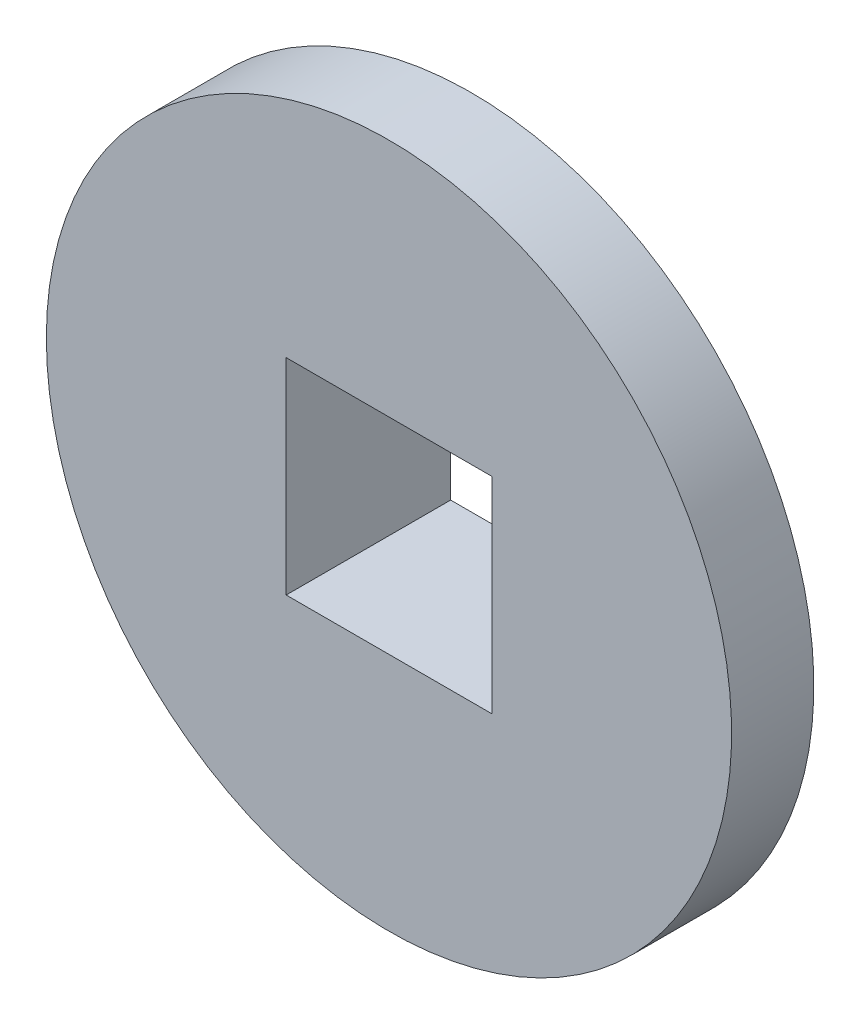
ISO-10303-21;
HEADER;
FILE_DESCRIPTION(('STEP AP214'),'2;1');
FILE_NAME('part.step','',(''),(''),'','','');
FILE_SCHEMA(('AUTOMOTIVE_DESIGN { 1 0 10303 214 1 1 1 1 }'));
ENDSEC;
DATA;
#1=APPLICATION_CONTEXT('core data for automotive mechanical design processes');
#2=APPLICATION_PROTOCOL_DEFINITION('international standard','automotive_design',2000,#1);
#3=PRODUCT_CONTEXT('',#1,'mechanical');
#4=PRODUCT('Part','Part','',(#3));
#5=PRODUCT_RELATED_PRODUCT_CATEGORY('part','',(#4));
#6=PRODUCT_DEFINITION_FORMATION('','',#4);
#7=PRODUCT_DEFINITION_CONTEXT('part definition',#1,'design');
#8=PRODUCT_DEFINITION('design','',#6,#7);
#9=PRODUCT_DEFINITION_SHAPE('','',#8);
#10=(LENGTH_UNIT() NAMED_UNIT(*) SI_UNIT(.MILLI.,.METRE.));
#11=(NAMED_UNIT(*) PLANE_ANGLE_UNIT() SI_UNIT($,.RADIAN.));
#12=(NAMED_UNIT(*) SI_UNIT($,.STERADIAN.) SOLID_ANGLE_UNIT());
#13=UNCERTAINTY_MEASURE_WITH_UNIT(LENGTH_MEASURE(1.E-05),#10,'distance_accuracy_value','');
#14=(GEOMETRIC_REPRESENTATION_CONTEXT(3) GLOBAL_UNCERTAINTY_ASSIGNED_CONTEXT((#13)) GLOBAL_UNIT_ASSIGNED_CONTEXT((#10,
#11,#12)) REPRESENTATION_CONTEXT('',''));
#15=CARTESIAN_POINT('',(0.,0.,0.));
#16=DIRECTION('',(0.,0.,1.));
#17=DIRECTION('',(1.,0.,0.));
#18=AXIS2_PLACEMENT_3D('',#15,#16,#17);
#19=CARTESIAN_POINT('',(-130.201551665356,15.0776302187978,3.81));
#20=DIRECTION('',(0.,0.,-1.));
#21=DIRECTION('',(-1.,0.,0.));
#22=AXIS2_PLACEMENT_3D('',#19,#20,#21);
#23=CYLINDRICAL_SURFACE('',#22,15.875);
#24=CARTESIAN_POINT('',(-130.201551665356,15.0776302187978,3.81));
#25=DIRECTION('',(0.,0.,1.));
#26=DIRECTION('',(1.,0.,0.));
#27=AXIS2_PLACEMENT_3D('',#24,#25,#26);
#28=CIRCLE('',#27,15.875);
#29=CARTESIAN_POINT('',(-146.076551665356,15.0776302187978,3.81));
#30=VERTEX_POINT('',#29);
#31=EDGE_CURVE('E40',#30,#30,#28,.T.);
#32=CARTESIAN_POINT('',(-130.201551665356,15.0776302187978,0.));
#33=DIRECTION('',(0.,0.,1.));
#34=DIRECTION('',(1.,0.,0.));
#35=AXIS2_PLACEMENT_3D('',#32,#33,#34);
#36=CIRCLE('',#35,15.875);
#37=CARTESIAN_POINT('',(-146.076551665356,15.0776302187978,0.));
#38=VERTEX_POINT('',#37);
#39=EDGE_CURVE('E35',#38,#38,#36,.T.);
#40=CARTESIAN_POINT('',(-146.076551665356,15.0776302187978,3.81));
#41=CARTESIAN_POINT('',(-146.076551665356,15.0776302187978,3.7703125));
#42=CARTESIAN_POINT('',(-146.076551665356,15.0776302187978,3.730625));
#43=CARTESIAN_POINT('',(-146.076551665356,15.0776302187978,3.65125));
#44=CARTESIAN_POINT('',(-146.076551665356,15.0776302187978,3.6115625));
#45=CARTESIAN_POINT('',(-146.076551665356,15.0776302187978,3.5321875));
#46=CARTESIAN_POINT('',(-146.076551665356,15.0776302187978,3.4925));
#47=CARTESIAN_POINT('',(-146.076551665356,15.0776302187978,3.413125));
#48=CARTESIAN_POINT('',(-146.076551665356,15.0776302187978,3.3734375));
#49=CARTESIAN_POINT('',(-146.076551665356,15.0776302187978,3.2940625));
#50=CARTESIAN_POINT('',(-146.076551665356,15.0776302187978,3.254375));
#51=CARTESIAN_POINT('',(-146.076551665356,15.0776302187978,3.175));
#52=CARTESIAN_POINT('',(-146.076551665356,15.0776302187978,3.1353125));
#53=CARTESIAN_POINT('',(-146.076551665356,15.0776302187978,3.0559375));
#54=CARTESIAN_POINT('',(-146.076551665356,15.0776302187978,3.01625));
#55=CARTESIAN_POINT('',(-146.076551665356,15.0776302187978,2.936875));
#56=CARTESIAN_POINT('',(-146.076551665356,15.0776302187978,2.8971875));
#57=CARTESIAN_POINT('',(-146.076551665356,15.0776302187978,2.8178125));
#58=CARTESIAN_POINT('',(-146.076551665356,15.0776302187978,2.778125));
#59=CARTESIAN_POINT('',(-146.076551665356,15.0776302187978,2.69875));
#60=CARTESIAN_POINT('',(-146.076551665356,15.0776302187978,2.6590625));
#61=CARTESIAN_POINT('',(-146.076551665356,15.0776302187978,2.5796875));
#62=CARTESIAN_POINT('',(-146.076551665356,15.0776302187978,2.54));
#63=CARTESIAN_POINT('',(-146.076551665356,15.0776302187978,2.460625));
#64=CARTESIAN_POINT('',(-146.076551665356,15.0776302187978,2.4209375));
#65=CARTESIAN_POINT('',(-146.076551665356,15.0776302187978,2.3415625));
#66=CARTESIAN_POINT('',(-146.076551665356,15.0776302187978,2.301875));
#67=CARTESIAN_POINT('',(-146.076551665356,15.0776302187978,2.2225));
#68=CARTESIAN_POINT('',(-146.076551665356,15.0776302187978,2.1828125));
#69=CARTESIAN_POINT('',(-146.076551665356,15.0776302187978,2.1034375));
#70=CARTESIAN_POINT('',(-146.076551665356,15.0776302187978,2.06375));
#71=CARTESIAN_POINT('',(-146.076551665356,15.0776302187978,1.984375));
#72=CARTESIAN_POINT('',(-146.076551665356,15.0776302187978,1.9446875));
#73=CARTESIAN_POINT('',(-146.076551665356,15.0776302187978,1.8653125));
#74=CARTESIAN_POINT('',(-146.076551665356,15.0776302187978,1.825625));
#75=CARTESIAN_POINT('',(-146.076551665356,15.0776302187978,1.74625));
#76=CARTESIAN_POINT('',(-146.076551665356,15.0776302187978,1.7065625));
#77=CARTESIAN_POINT('',(-146.076551665356,15.0776302187978,1.6271875));
#78=CARTESIAN_POINT('',(-146.076551665356,15.0776302187978,1.5875));
#79=CARTESIAN_POINT('',(-146.076551665356,15.0776302187978,1.508125));
#80=CARTESIAN_POINT('',(-146.076551665356,15.0776302187978,1.4684375));
#81=CARTESIAN_POINT('',(-146.076551665356,15.0776302187978,1.3890625));
#82=CARTESIAN_POINT('',(-146.076551665356,15.0776302187978,1.349375));
#83=CARTESIAN_POINT('',(-146.076551665356,15.0776302187978,1.27));
#84=CARTESIAN_POINT('',(-146.076551665356,15.0776302187978,1.2303125));
#85=CARTESIAN_POINT('',(-146.076551665356,15.0776302187978,1.1509375));
#86=CARTESIAN_POINT('',(-146.076551665356,15.0776302187978,1.11125));
#87=CARTESIAN_POINT('',(-146.076551665356,15.0776302187978,1.031875));
#88=CARTESIAN_POINT('',(-146.076551665356,15.0776302187978,0.9921875));
#89=CARTESIAN_POINT('',(-146.076551665356,15.0776302187978,0.9128125));
#90=CARTESIAN_POINT('',(-146.076551665356,15.0776302187978,0.873125));
#91=CARTESIAN_POINT('',(-146.076551665356,15.0776302187978,0.79375));
#92=CARTESIAN_POINT('',(-146.076551665356,15.0776302187978,0.7540625));
#93=CARTESIAN_POINT('',(-146.076551665356,15.0776302187978,0.6746875));
#94=CARTESIAN_POINT('',(-146.076551665356,15.0776302187978,0.635));
#95=CARTESIAN_POINT('',(-146.076551665356,15.0776302187978,0.555625));
#96=CARTESIAN_POINT('',(-146.076551665356,15.0776302187978,0.5159375));
#97=CARTESIAN_POINT('',(-146.076551665356,15.0776302187978,0.4365625));
#98=CARTESIAN_POINT('',(-146.076551665356,15.0776302187978,0.396875));
#99=CARTESIAN_POINT('',(-146.076551665356,15.0776302187978,0.3175));
#100=CARTESIAN_POINT('',(-146.076551665356,15.0776302187978,0.2778125));
#101=CARTESIAN_POINT('',(-146.076551665356,15.0776302187978,0.1984375));
#102=CARTESIAN_POINT('',(-146.076551665356,15.0776302187978,0.15875));
#103=CARTESIAN_POINT('',(-146.076551665356,15.0776302187978,0.0793749999999999));
#104=CARTESIAN_POINT('',(-146.076551665356,15.0776302187978,0.0396874999999999));
#105=CARTESIAN_POINT('',(-146.076551665356,15.0776302187978,0.));
#106=B_SPLINE_CURVE_WITH_KNOTS('',3,(#40,#41,#42,#43,#44,#45,#46,#47,#48,#49,#50,#51,#52,#53,
#54,#55,#56,#57,#58,#59,#60,#61,#62,#63,#64,#65,#66,#67,#68,#69,#70,#71,#72,#73,#74,#75,#76,#77,
#78,#79,#80,#81,#82,#83,#84,#85,#86,#87,#88,#89,#90,#91,#92,#93,#94,#95,#96,#97,#98,#99,#100,
#101,#102,#103,#104,#105),.UNSPECIFIED.,.F.,.F.,(4,2,2,2,2,2,2,2,2,2,2,2,2,2,2,2,2,2,2,2,2,2,2,
2,2,2,2,2,2,2,2,2,4),(0.,0.1190625,0.238125,0.3571875,0.47625,0.5953125,0.714375,0.8334375,
0.9525,1.0715625,1.190625,1.3096875,1.42875,1.5478125,1.666875,1.7859375,1.905,2.0240625,
2.143125,2.2621875,2.38125,2.5003125,2.619375,2.7384375,2.8575,2.9765625,3.095625,3.2146875,
3.33375,3.4528125,3.571875,3.6909375,3.81),.UNSPECIFIED.);
#107=EDGE_CURVE('BSEAM32',#30,#38,#106,.T.);
#108=ORIENTED_EDGE('',*,*,#31,.F.);
#109=ORIENTED_EDGE('',*,*,#39,.T.);
#110=ORIENTED_EDGE('',*,*,#107,.T.);
#111=ORIENTED_EDGE('',*,*,#107,.F.);
#112=EDGE_LOOP('',(#108,#110,#109,#111));
#113=FACE_BOUND('',#112,.T.);
#114=ADVANCED_FACE('F32',(#113),#23,.T.);
#115=CARTESIAN_POINT('',(-130.201551665356,15.0776302187978,3.81));
#116=DIRECTION('',(0.,0.,1.));
#117=DIRECTION('',(1.,0.,0.));
#118=AXIS2_PLACEMENT_3D('',#115,#116,#117);
#119=PLANE('',#118);
#120=DIRECTION('',(0.,-1.,0.));
#121=VECTOR('',#120,1.);
#122=CARTESIAN_POINT('',(-134.964051665356,15.0776302187978,3.81));
#123=LINE('',#122,#121);
#124=CARTESIAN_POINT('',(-134.964051665356,19.8401302187978,3.81));
#125=VERTEX_POINT('',#124);
#126=CARTESIAN_POINT('',(-134.964051665356,10.3151302187978,3.81));
#127=VERTEX_POINT('',#126);
#128=EDGE_CURVE('E107',#125,#127,#123,.T.);
#129=ORIENTED_EDGE('',*,*,#128,.F.);
#130=DIRECTION('',(-1.,0.,0.));
#131=VECTOR('',#130,1.);
#132=CARTESIAN_POINT('',(-130.201551665356,19.8401302187978,3.81));
#133=LINE('',#132,#131);
#134=CARTESIAN_POINT('',(-125.439051665356,19.8401302187978,3.81));
#135=VERTEX_POINT('',#134);
#136=EDGE_CURVE('E100',#135,#125,#133,.T.);
#137=ORIENTED_EDGE('',*,*,#136,.F.);
#138=DIRECTION('',(0.,1.,0.));
#139=VECTOR('',#138,1.);
#140=CARTESIAN_POINT('',(-125.439051665356,15.0776302187978,3.81));
#141=LINE('',#140,#139);
#142=CARTESIAN_POINT('',(-125.439051665356,10.3151302187978,3.81));
#143=VERTEX_POINT('',#142);
#144=EDGE_CURVE('E80',#143,#135,#141,.T.);
#145=ORIENTED_EDGE('',*,*,#144,.F.);
#146=DIRECTION('',(1.,0.,0.));
#147=VECTOR('',#146,1.);
#148=CARTESIAN_POINT('',(-130.201551665356,10.3151302187978,3.81));
#149=LINE('',#148,#147);
#150=EDGE_CURVE('E105',#127,#143,#149,.T.);
#151=ORIENTED_EDGE('',*,*,#150,.F.);
#152=EDGE_LOOP('',(#129,#137,#145,#151));
#153=FACE_BOUND('',#152,.T.);
#154=ORIENTED_EDGE('',*,*,#31,.T.);
#155=EDGE_LOOP('',(#154));
#156=FACE_BOUND('',#155,.T.);
#157=ADVANCED_FACE('F121',(#153,#156),#119,.T.);
#158=CARTESIAN_POINT('',(-130.201551665356,15.0776302187978,0.));
#159=DIRECTION('',(0.,0.,1.));
#160=DIRECTION('',(1.,0.,0.));
#161=AXIS2_PLACEMENT_3D('',#158,#159,#160);
#162=PLANE('',#161);
#163=CARTESIAN_POINT('',(-130.201551665356,15.0776302187978,0.));
#164=DIRECTION('',(0.,0.,-1.));
#165=DIRECTION('',(-1.,0.,0.));
#166=AXIS2_PLACEMENT_3D('',#163,#164,#165);
#167=CIRCLE('',#166,9.14400000000001);
#168=CARTESIAN_POINT('',(-121.057551665356,15.0776302187978,0.));
#169=VERTEX_POINT('',#168);
#170=EDGE_CURVE('E11',#169,#169,#167,.T.);
#171=ORIENTED_EDGE('',*,*,#170,.F.);
#172=EDGE_LOOP('',(#171));
#173=FACE_BOUND('',#172,.T.);
#174=ORIENTED_EDGE('',*,*,#39,.F.);
#175=EDGE_LOOP('',(#174));
#176=FACE_BOUND('',#175,.T.);
#177=ADVANCED_FACE('F118',(#173,#176),#162,.F.);
#178=CARTESIAN_POINT('',(-130.201551665356,15.0776302187978,-3.81));
#179=DIRECTION('',(0.,0.,1.));
#180=DIRECTION('',(1.,0.,0.));
#181=AXIS2_PLACEMENT_3D('',#178,#179,#180);
#182=CYLINDRICAL_SURFACE('',#181,9.14400000000001);
#183=CARTESIAN_POINT('',(-130.201551665356,15.0776302187978,-3.81));
#184=DIRECTION('',(0.,0.,-1.));
#185=DIRECTION('',(-1.,0.,0.));
#186=AXIS2_PLACEMENT_3D('',#183,#184,#185);
#187=CIRCLE('',#186,9.14400000000001);
#188=CARTESIAN_POINT('',(-121.057551665356,15.0776302187978,-3.81));
#189=VERTEX_POINT('',#188);
#190=EDGE_CURVE('E109',#189,#189,#187,.T.);
#191=CARTESIAN_POINT('',(-121.057551665356,15.0776302187978,-3.81));
#192=CARTESIAN_POINT('',(-121.057551665356,15.0776302187978,-3.7703125));
#193=CARTESIAN_POINT('',(-121.057551665356,15.0776302187978,-3.730625));
#194=CARTESIAN_POINT('',(-121.057551665356,15.0776302187978,-3.65125));
#195=CARTESIAN_POINT('',(-121.057551665356,15.0776302187978,-3.6115625));
#196=CARTESIAN_POINT('',(-121.057551665356,15.0776302187978,-3.5321875));
#197=CARTESIAN_POINT('',(-121.057551665356,15.0776302187978,-3.4925));
#198=CARTESIAN_POINT('',(-121.057551665356,15.0776302187978,-3.413125));
#199=CARTESIAN_POINT('',(-121.057551665356,15.0776302187978,-3.3734375));
#200=CARTESIAN_POINT('',(-121.057551665356,15.0776302187978,-3.2940625));
#201=CARTESIAN_POINT('',(-121.057551665356,15.0776302187978,-3.254375));
#202=CARTESIAN_POINT('',(-121.057551665356,15.0776302187978,-3.175));
#203=CARTESIAN_POINT('',(-121.057551665356,15.0776302187978,-3.1353125));
#204=CARTESIAN_POINT('',(-121.057551665356,15.0776302187978,-3.0559375));
#205=CARTESIAN_POINT('',(-121.057551665356,15.0776302187978,-3.01625));
#206=CARTESIAN_POINT('',(-121.057551665356,15.0776302187978,-2.936875));
#207=CARTESIAN_POINT('',(-121.057551665356,15.0776302187978,-2.8971875));
#208=CARTESIAN_POINT('',(-121.057551665356,15.0776302187978,-2.8178125));
#209=CARTESIAN_POINT('',(-121.057551665356,15.0776302187978,-2.778125));
#210=CARTESIAN_POINT('',(-121.057551665356,15.0776302187978,-2.69875));
#211=CARTESIAN_POINT('',(-121.057551665356,15.0776302187978,-2.6590625));
#212=CARTESIAN_POINT('',(-121.057551665356,15.0776302187978,-2.5796875));
#213=CARTESIAN_POINT('',(-121.057551665356,15.0776302187978,-2.54));
#214=CARTESIAN_POINT('',(-121.057551665356,15.0776302187978,-2.460625));
#215=CARTESIAN_POINT('',(-121.057551665356,15.0776302187978,-2.4209375));
#216=CARTESIAN_POINT('',(-121.057551665356,15.0776302187978,-2.3415625));
#217=CARTESIAN_POINT('',(-121.057551665356,15.0776302187978,-2.301875));
#218=CARTESIAN_POINT('',(-121.057551665356,15.0776302187978,-2.2225));
#219=CARTESIAN_POINT('',(-121.057551665356,15.0776302187978,-2.1828125));
#220=CARTESIAN_POINT('',(-121.057551665356,15.0776302187978,-2.1034375));
#221=CARTESIAN_POINT('',(-121.057551665356,15.0776302187978,-2.06375));
#222=CARTESIAN_POINT('',(-121.057551665356,15.0776302187978,-1.984375));
#223=CARTESIAN_POINT('',(-121.057551665356,15.0776302187978,-1.9446875));
#224=CARTESIAN_POINT('',(-121.057551665356,15.0776302187978,-1.8653125));
#225=CARTESIAN_POINT('',(-121.057551665356,15.0776302187978,-1.825625));
#226=CARTESIAN_POINT('',(-121.057551665356,15.0776302187978,-1.74625));
#227=CARTESIAN_POINT('',(-121.057551665356,15.0776302187978,-1.7065625));
#228=CARTESIAN_POINT('',(-121.057551665356,15.0776302187978,-1.6271875));
#229=CARTESIAN_POINT('',(-121.057551665356,15.0776302187978,-1.5875));
#230=CARTESIAN_POINT('',(-121.057551665356,15.0776302187978,-1.508125));
#231=CARTESIAN_POINT('',(-121.057551665356,15.0776302187978,-1.4684375));
#232=CARTESIAN_POINT('',(-121.057551665356,15.0776302187978,-1.3890625));
#233=CARTESIAN_POINT('',(-121.057551665356,15.0776302187978,-1.349375));
#234=CARTESIAN_POINT('',(-121.057551665356,15.0776302187978,-1.27));
#235=CARTESIAN_POINT('',(-121.057551665356,15.0776302187978,-1.2303125));
#236=CARTESIAN_POINT('',(-121.057551665356,15.0776302187978,-1.1509375));
#237=CARTESIAN_POINT('',(-121.057551665356,15.0776302187978,-1.11125));
#238=CARTESIAN_POINT('',(-121.057551665356,15.0776302187978,-1.031875));
#239=CARTESIAN_POINT('',(-121.057551665356,15.0776302187978,-0.9921875));
#240=CARTESIAN_POINT('',(-121.057551665356,15.0776302187978,-0.9128125));
#241=CARTESIAN_POINT('',(-121.057551665356,15.0776302187978,-0.873125));
#242=CARTESIAN_POINT('',(-121.057551665356,15.0776302187978,-0.79375));
#243=CARTESIAN_POINT('',(-121.057551665356,15.0776302187978,-0.7540625));
#244=CARTESIAN_POINT('',(-121.057551665356,15.0776302187978,-0.6746875));
#245=CARTESIAN_POINT('',(-121.057551665356,15.0776302187978,-0.635));
#246=CARTESIAN_POINT('',(-121.057551665356,15.0776302187978,-0.555625));
#247=CARTESIAN_POINT('',(-121.057551665356,15.0776302187978,-0.5159375));
#248=CARTESIAN_POINT('',(-121.057551665356,15.0776302187978,-0.4365625));
#249=CARTESIAN_POINT('',(-121.057551665356,15.0776302187978,-0.396875));
#250=CARTESIAN_POINT('',(-121.057551665356,15.0776302187978,-0.3175));
#251=CARTESIAN_POINT('',(-121.057551665356,15.0776302187978,-0.2778125));
#252=CARTESIAN_POINT('',(-121.057551665356,15.0776302187978,-0.1984375));
#253=CARTESIAN_POINT('',(-121.057551665356,15.0776302187978,-0.15875));
#254=CARTESIAN_POINT('',(-121.057551665356,15.0776302187978,-0.0793749999999999));
#255=CARTESIAN_POINT('',(-121.057551665356,15.0776302187978,-0.0396874999999999));
#256=CARTESIAN_POINT('',(-121.057551665356,15.0776302187978,0.));
#257=B_SPLINE_CURVE_WITH_KNOTS('',3,(#191,#192,#193,#194,#195,#196,#197,#198,#199,#200,#201,
#202,#203,#204,#205,#206,#207,#208,#209,#210,#211,#212,#213,#214,#215,#216,#217,#218,#219,#220,
#221,#222,#223,#224,#225,#226,#227,#228,#229,#230,#231,#232,#233,#234,#235,#236,#237,#238,#239,
#240,#241,#242,#243,#244,#245,#246,#247,#248,#249,#250,#251,#252,#253,#254,#255,#256),
.UNSPECIFIED.,.F.,.F.,(4,2,2,2,2,2,2,2,2,2,2,2,2,2,2,2,2,2,2,2,2,2,2,2,2,2,2,2,2,2,2,2,4),(0.,
0.1190625,0.238125,0.3571875,0.47625,0.5953125,0.714375,0.8334375,0.9525,1.0715625,1.190625,
1.3096875,1.42875,1.5478125,1.666875,1.7859375,1.905,2.0240625,2.143125,2.2621875,2.38125,
2.5003125,2.619375,2.7384375,2.8575,2.9765625,3.095625,3.2146875,3.33375,3.4528125,3.571875,
3.6909375,3.81),.UNSPECIFIED.);
#258=EDGE_CURVE('BSEAM120',#189,#169,#257,.T.);
#259=ORIENTED_EDGE('',*,*,#190,.F.);
#260=ORIENTED_EDGE('',*,*,#170,.T.);
#261=ORIENTED_EDGE('',*,*,#258,.T.);
#262=ORIENTED_EDGE('',*,*,#258,.F.);
#263=EDGE_LOOP('',(#259,#261,#260,#262));
#264=FACE_BOUND('',#263,.T.);
#265=ADVANCED_FACE('F120',(#264),#182,.T.);
#266=CARTESIAN_POINT('',(-130.201551665356,15.0776302187978,-3.81));
#267=DIRECTION('',(0.,0.,-1.));
#268=DIRECTION('',(-1.,0.,0.));
#269=AXIS2_PLACEMENT_3D('',#266,#267,#268);
#270=PLANE('',#269);
#271=DIRECTION('',(0.,1.,0.));
#272=VECTOR('',#271,1.);
#273=CARTESIAN_POINT('',(-134.964051665356,10.3151302187978,-3.81));
#274=LINE('',#273,#272);
#275=CARTESIAN_POINT('',(-134.964051665356,10.3151302187978,-3.81));
#276=VERTEX_POINT('',#275);
#277=CARTESIAN_POINT('',(-134.964051665356,19.8401302187978,-3.81));
#278=VERTEX_POINT('',#277);
#279=EDGE_CURVE('E56',#276,#278,#274,.T.);
#280=ORIENTED_EDGE('',*,*,#279,.F.);
#281=DIRECTION('',(-1.,0.,0.));
#282=VECTOR('',#281,1.);
#283=CARTESIAN_POINT('',(-125.439051665356,10.3151302187978,-3.81));
#284=LINE('',#283,#282);
#285=CARTESIAN_POINT('',(-125.439051665356,10.3151302187978,-3.81));
#286=VERTEX_POINT('',#285);
#287=EDGE_CURVE('E93',#286,#276,#284,.T.);
#288=ORIENTED_EDGE('',*,*,#287,.F.);
#289=DIRECTION('',(0.,-1.,0.));
#290=VECTOR('',#289,1.);
#291=CARTESIAN_POINT('',(-125.439051665356,10.3151302187978,-3.81));
#292=LINE('',#291,#290);
#293=CARTESIAN_POINT('',(-125.439051665356,19.8401302187978,-3.81));
#294=VERTEX_POINT('',#293);
#295=EDGE_CURVE('E77',#294,#286,#292,.T.);
#296=ORIENTED_EDGE('',*,*,#295,.F.);
#297=DIRECTION('',(1.,0.,0.));
#298=VECTOR('',#297,1.);
#299=CARTESIAN_POINT('',(-125.439051665356,19.8401302187978,-3.81));
#300=LINE('',#299,#298);
#301=EDGE_CURVE('E86',#278,#294,#300,.T.);
#302=ORIENTED_EDGE('',*,*,#301,.F.);
#303=EDGE_LOOP('',(#280,#288,#296,#302));
#304=FACE_BOUND('',#303,.T.);
#305=ORIENTED_EDGE('',*,*,#190,.T.);
#306=EDGE_LOOP('',(#305));
#307=FACE_BOUND('',#306,.T.);
#308=ADVANCED_FACE('F90',(#304,#307),#270,.T.);
#309=CARTESIAN_POINT('',(-134.964051665356,10.3151302187978,5.842));
#310=DIRECTION('',(-1.,0.,0.));
#311=DIRECTION('',(0.,0.,1.));
#312=AXIS2_PLACEMENT_3D('',#309,#310,#311);
#313=PLANE('',#312);
#314=ORIENTED_EDGE('',*,*,#128,.T.);
#315=DIRECTION('',(0.,0.,-1.));
#316=VECTOR('',#315,1.);
#317=CARTESIAN_POINT('',(-134.964051665356,10.3151302187978,5.842));
#318=LINE('',#317,#316);
#319=EDGE_CURVE('E98',#127,#276,#318,.T.);
#320=ORIENTED_EDGE('',*,*,#319,.T.);
#321=ORIENTED_EDGE('',*,*,#279,.T.);
#322=DIRECTION('',(0.,0.,-1.));
#323=VECTOR('',#322,1.);
#324=CARTESIAN_POINT('',(-134.964051665356,19.8401302187978,5.842));
#325=LINE('',#324,#323);
#326=EDGE_CURVE('E83',#125,#278,#325,.T.);
#327=ORIENTED_EDGE('',*,*,#326,.F.);
#328=EDGE_LOOP('',(#314,#320,#321,#327));
#329=FACE_BOUND('',#328,.T.);
#330=ADVANCED_FACE('F153',(#329),#313,.F.);
#331=CARTESIAN_POINT('',(-125.439051665356,10.3151302187978,5.842));
#332=DIRECTION('',(0.,-1.,0.));
#333=DIRECTION('',(0.,0.,-1.));
#334=AXIS2_PLACEMENT_3D('',#331,#332,#333);
#335=PLANE('',#334);
#336=ORIENTED_EDGE('',*,*,#150,.T.);
#337=DIRECTION('',(0.,0.,-1.));
#338=VECTOR('',#337,1.);
#339=CARTESIAN_POINT('',(-125.439051665356,10.3151302187978,5.842));
#340=LINE('',#339,#338);
#341=EDGE_CURVE('E82',#143,#286,#340,.T.);
#342=ORIENTED_EDGE('',*,*,#341,.T.);
#343=ORIENTED_EDGE('',*,*,#287,.T.);
#344=ORIENTED_EDGE('',*,*,#319,.F.);
#345=EDGE_LOOP('',(#336,#342,#343,#344));
#346=FACE_BOUND('',#345,.T.);
#347=ADVANCED_FACE('F162',(#346),#335,.F.);
#348=CARTESIAN_POINT('',(-125.439051665356,10.3151302187978,5.842));
#349=DIRECTION('',(1.,0.,0.));
#350=DIRECTION('',(0.,0.,-1.));
#351=AXIS2_PLACEMENT_3D('',#348,#349,#350);
#352=PLANE('',#351);
#353=ORIENTED_EDGE('',*,*,#144,.T.);
#354=DIRECTION('',(0.,0.,-1.));
#355=VECTOR('',#354,1.);
#356=CARTESIAN_POINT('',(-125.439051665356,19.8401302187978,5.842));
#357=LINE('',#356,#355);
#358=EDGE_CURVE('E48',#135,#294,#357,.T.);
#359=ORIENTED_EDGE('',*,*,#358,.T.);
#360=ORIENTED_EDGE('',*,*,#295,.T.);
#361=ORIENTED_EDGE('',*,*,#341,.F.);
#362=EDGE_LOOP('',(#353,#359,#360,#361));
#363=FACE_BOUND('',#362,.T.);
#364=ADVANCED_FACE('F74',(#363),#352,.F.);
#365=CARTESIAN_POINT('',(-125.439051665356,19.8401302187978,5.842));
#366=DIRECTION('',(0.,1.,0.));
#367=DIRECTION('',(0.,0.,1.));
#368=AXIS2_PLACEMENT_3D('',#365,#366,#367);
#369=PLANE('',#368);
#370=ORIENTED_EDGE('',*,*,#136,.T.);
#371=ORIENTED_EDGE('',*,*,#326,.T.);
#372=ORIENTED_EDGE('',*,*,#301,.T.);
#373=ORIENTED_EDGE('',*,*,#358,.F.);
#374=EDGE_LOOP('',(#370,#371,#372,#373));
#375=FACE_BOUND('',#374,.T.);
#376=ADVANCED_FACE('F87',(#375),#369,.F.);
#377=CLOSED_SHELL('',(#114,#157,#177,#265,#308,#330,#347,#364,#376));
#378=MANIFOLD_SOLID_BREP('B2',#377);
#379=ADVANCED_BREP_SHAPE_REPRESENTATION('',(#18,#378),#14);
#380=SHAPE_DEFINITION_REPRESENTATION(#9,#379);
ENDSEC;
END-ISO-10303-21;
